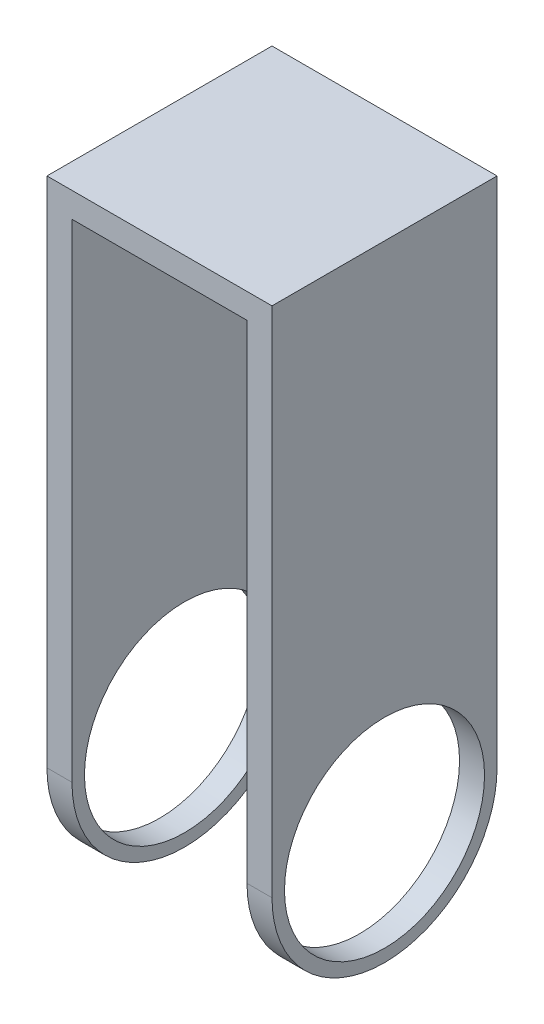
ISO-10303-21;
HEADER;
FILE_DESCRIPTION(('STEP AP214'),'2;1');
FILE_NAME('part.step','',(''),(''),'','','');
FILE_SCHEMA(('AUTOMOTIVE_DESIGN { 1 0 10303 214 1 1 1 1 }'));
ENDSEC;
DATA;
#1=APPLICATION_CONTEXT('core data for automotive mechanical design processes');
#2=APPLICATION_PROTOCOL_DEFINITION('international standard','automotive_design',2000,#1);
#3=PRODUCT_CONTEXT('',#1,'mechanical');
#4=PRODUCT('Part','Part','',(#3));
#5=PRODUCT_RELATED_PRODUCT_CATEGORY('part','',(#4));
#6=PRODUCT_DEFINITION_FORMATION('','',#4);
#7=PRODUCT_DEFINITION_CONTEXT('part definition',#1,'design');
#8=PRODUCT_DEFINITION('design','',#6,#7);
#9=PRODUCT_DEFINITION_SHAPE('','',#8);
#10=(LENGTH_UNIT() NAMED_UNIT(*) SI_UNIT(.MILLI.,.METRE.));
#11=(NAMED_UNIT(*) PLANE_ANGLE_UNIT() SI_UNIT($,.RADIAN.));
#12=(NAMED_UNIT(*) SI_UNIT($,.STERADIAN.) SOLID_ANGLE_UNIT());
#13=UNCERTAINTY_MEASURE_WITH_UNIT(LENGTH_MEASURE(1.E-05),#10,'distance_accuracy_value','');
#14=(GEOMETRIC_REPRESENTATION_CONTEXT(3) GLOBAL_UNCERTAINTY_ASSIGNED_CONTEXT((#13)) GLOBAL_UNIT_ASSIGNED_CONTEXT((#10,
#11,#12)) REPRESENTATION_CONTEXT('',''));
#15=CARTESIAN_POINT('',(0.,0.,0.));
#16=DIRECTION('',(0.,0.,1.));
#17=DIRECTION('',(1.,0.,0.));
#18=AXIS2_PLACEMENT_3D('',#15,#16,#17);
#19=CARTESIAN_POINT('',(4.,1.,-4.5));
#20=DIRECTION('',(-1.,0.,0.));
#21=DIRECTION('',(0.,0.,1.));
#22=AXIS2_PLACEMENT_3D('',#19,#20,#21);
#23=PLANE('',#22);
#24=DIRECTION('',(0.,-1.,0.));
#25=VECTOR('',#24,1.);
#26=CARTESIAN_POINT('',(4.,1.,4.5));
#27=LINE('',#26,#25);
#28=CARTESIAN_POINT('',(4.,1.,4.5));
#29=VERTEX_POINT('',#28);
#30=CARTESIAN_POINT('',(3.99999999999997,-19.5,4.5));
#31=VERTEX_POINT('',#30);
#32=EDGE_CURVE('E101',#29,#31,#27,.T.);
#33=ORIENTED_EDGE('',*,*,#32,.T.);
#34=CARTESIAN_POINT('',(4.,-19.5,0.));
#35=DIRECTION('',(-1.,0.,0.));
#36=DIRECTION('',(0.,0.,1.));
#37=AXIS2_PLACEMENT_3D('',#34,#35,#36);
#38=CIRCLE('',#37,4.5);
#39=CARTESIAN_POINT('',(4.00000000000003,-19.5,-4.5));
#40=VERTEX_POINT('',#39);
#41=EDGE_CURVE('E141',#40,#31,#38,.T.);
#42=ORIENTED_EDGE('',*,*,#41,.F.);
#43=DIRECTION('',(0.,-1.,0.));
#44=VECTOR('',#43,1.);
#45=CARTESIAN_POINT('',(4.,1.,-4.5));
#46=LINE('',#45,#44);
#47=CARTESIAN_POINT('',(4.,1.,-4.5));
#48=VERTEX_POINT('',#47);
#49=EDGE_CURVE('E44',#48,#40,#46,.T.);
#50=ORIENTED_EDGE('',*,*,#49,.F.);
#51=DIRECTION('',(0.,0.,-1.));
#52=VECTOR('',#51,1.);
#53=CARTESIAN_POINT('',(4.,1.,-4.5));
#54=LINE('',#53,#52);
#55=EDGE_CURVE('E158',#29,#48,#54,.T.);
#56=ORIENTED_EDGE('',*,*,#55,.F.);
#57=EDGE_LOOP('',(#33,#42,#50,#56));
#58=FACE_BOUND('',#57,.T.);
#59=CARTESIAN_POINT('',(4.,-19.5,0.));
#60=DIRECTION('',(-1.,0.,0.));
#61=DIRECTION('',(0.,0.,1.));
#62=AXIS2_PLACEMENT_3D('',#59,#60,#61);
#63=CIRCLE('',#62,4.);
#64=CARTESIAN_POINT('',(3.99999999999997,-19.5,4.));
#65=VERTEX_POINT('',#64);
#66=EDGE_CURVE('E136',#65,#65,#63,.T.);
#67=ORIENTED_EDGE('',*,*,#66,.T.);
#68=EDGE_LOOP('',(#67));
#69=FACE_BOUND('',#68,.T.);
#70=ADVANCED_FACE('F36',(#58,#69),#23,.F.);
#71=CARTESIAN_POINT('',(-4.,1.,-4.5));
#72=DIRECTION('',(0.,0.,1.));
#73=DIRECTION('',(1.,0.,0.));
#74=AXIS2_PLACEMENT_3D('',#71,#72,#73);
#75=PLANE('',#74);
#76=DIRECTION('',(-1.,0.,0.));
#77=VECTOR('',#76,1.);
#78=CARTESIAN_POINT('',(-4.,0.,-4.5));
#79=LINE('',#78,#77);
#80=CARTESIAN_POINT('',(3.00000000000003,0.,-4.50000000000001));
#81=VERTEX_POINT('',#80);
#82=CARTESIAN_POINT('',(-4.,0.,-4.5));
#83=VERTEX_POINT('',#82);
#84=EDGE_CURVE('E157',#81,#83,#79,.T.);
#85=ORIENTED_EDGE('',*,*,#84,.T.);
#86=DIRECTION('',(0.,1.,0.));
#87=VECTOR('',#86,1.);
#88=CARTESIAN_POINT('',(-4.,1.,-4.5));
#89=LINE('',#88,#87);
#90=CARTESIAN_POINT('',(-4.,-19.5,-4.5));
#91=VERTEX_POINT('',#90);
#92=EDGE_CURVE('E116',#91,#83,#89,.T.);
#93=ORIENTED_EDGE('',*,*,#92,.F.);
#94=DIRECTION('',(1.,0.,0.));
#95=VECTOR('',#94,1.);
#96=CARTESIAN_POINT('',(-5.,-19.5,-4.5));
#97=LINE('',#96,#95);
#98=CARTESIAN_POINT('',(-5.,-19.5,-4.5));
#99=VERTEX_POINT('',#98);
#100=EDGE_CURVE('E134',#99,#91,#97,.T.);
#101=ORIENTED_EDGE('',*,*,#100,.F.);
#102=DIRECTION('',(0.,1.,0.));
#103=VECTOR('',#102,1.);
#104=CARTESIAN_POINT('',(-5.,1.,-4.5));
#105=LINE('',#104,#103);
#106=CARTESIAN_POINT('',(-5.,1.,-4.5));
#107=VERTEX_POINT('',#106);
#108=EDGE_CURVE('E126',#99,#107,#105,.T.);
#109=ORIENTED_EDGE('',*,*,#108,.T.);
#110=DIRECTION('',(-1.,0.,0.));
#111=VECTOR('',#110,1.);
#112=CARTESIAN_POINT('',(-4.,1.,-4.5));
#113=LINE('',#112,#111);
#114=EDGE_CURVE('E103',#48,#107,#113,.T.);
#115=ORIENTED_EDGE('',*,*,#114,.F.);
#116=ORIENTED_EDGE('',*,*,#49,.T.);
#117=DIRECTION('',(1.,0.,0.));
#118=VECTOR('',#117,1.);
#119=CARTESIAN_POINT('',(3.00000000000003,-19.5,-4.5));
#120=LINE('',#119,#118);
#121=CARTESIAN_POINT('',(3.00000000000003,-19.5,-4.5));
#122=VERTEX_POINT('',#121);
#123=EDGE_CURVE('E154',#122,#40,#120,.T.);
#124=ORIENTED_EDGE('',*,*,#123,.F.);
#125=DIRECTION('',(0.,-1.,0.));
#126=VECTOR('',#125,1.);
#127=CARTESIAN_POINT('',(3.00000000000003,1.,-4.50000000000001));
#128=LINE('',#127,#126);
#129=EDGE_CURVE('E144',#81,#122,#128,.T.);
#130=ORIENTED_EDGE('',*,*,#129,.F.);
#131=EDGE_LOOP('',(#85,#93,#101,#109,#115,#116,#124,#130));
#132=FACE_BOUND('',#131,.T.);
#133=ADVANCED_FACE('F171',(#132),#75,.F.);
#134=CARTESIAN_POINT('',(-4.,1.,4.5));
#135=DIRECTION('',(0.,0.,-1.));
#136=DIRECTION('',(-1.,0.,0.));
#137=AXIS2_PLACEMENT_3D('',#134,#135,#136);
#138=PLANE('',#137);
#139=DIRECTION('',(1.,0.,0.));
#140=VECTOR('',#139,1.);
#141=CARTESIAN_POINT('',(-4.,0.,4.5));
#142=LINE('',#141,#140);
#143=CARTESIAN_POINT('',(-4.,0.,4.5));
#144=VERTEX_POINT('',#143);
#145=CARTESIAN_POINT('',(2.99999999999997,0.,4.49999999999999));
#146=VERTEX_POINT('',#145);
#147=EDGE_CURVE('E160',#144,#146,#142,.T.);
#148=ORIENTED_EDGE('',*,*,#147,.T.);
#149=DIRECTION('',(0.,1.,0.));
#150=VECTOR('',#149,1.);
#151=CARTESIAN_POINT('',(2.99999999999997,1.,4.49999999999999));
#152=LINE('',#151,#150);
#153=CARTESIAN_POINT('',(2.99999999999997,-19.5,4.5));
#154=VERTEX_POINT('',#153);
#155=EDGE_CURVE('E148',#154,#146,#152,.T.);
#156=ORIENTED_EDGE('',*,*,#155,.F.);
#157=DIRECTION('',(1.,0.,0.));
#158=VECTOR('',#157,1.);
#159=CARTESIAN_POINT('',(2.99999999999997,-19.5,4.5));
#160=LINE('',#159,#158);
#161=EDGE_CURVE('E150',#154,#31,#160,.T.);
#162=ORIENTED_EDGE('',*,*,#161,.T.);
#163=ORIENTED_EDGE('',*,*,#32,.F.);
#164=DIRECTION('',(1.,0.,0.));
#165=VECTOR('',#164,1.);
#166=CARTESIAN_POINT('',(-4.,1.,4.5));
#167=LINE('',#166,#165);
#168=CARTESIAN_POINT('',(-5.,1.,4.5));
#169=VERTEX_POINT('',#168);
#170=EDGE_CURVE('E51',#169,#29,#167,.T.);
#171=ORIENTED_EDGE('',*,*,#170,.F.);
#172=DIRECTION('',(0.,-1.,0.));
#173=VECTOR('',#172,1.);
#174=CARTESIAN_POINT('',(-5.,1.,4.5));
#175=LINE('',#174,#173);
#176=CARTESIAN_POINT('',(-5.,-19.5,4.5));
#177=VERTEX_POINT('',#176);
#178=EDGE_CURVE('E99',#169,#177,#175,.T.);
#179=ORIENTED_EDGE('',*,*,#178,.T.);
#180=DIRECTION('',(1.,0.,0.));
#181=VECTOR('',#180,1.);
#182=CARTESIAN_POINT('',(-5.,-19.5,4.5));
#183=LINE('',#182,#181);
#184=CARTESIAN_POINT('',(-4.,-19.5,4.5));
#185=VERTEX_POINT('',#184);
#186=EDGE_CURVE('E128',#177,#185,#183,.T.);
#187=ORIENTED_EDGE('',*,*,#186,.T.);
#188=DIRECTION('',(0.,-1.,0.));
#189=VECTOR('',#188,1.);
#190=CARTESIAN_POINT('',(-4.,1.,4.5));
#191=LINE('',#190,#189);
#192=EDGE_CURVE('E129',#144,#185,#191,.T.);
#193=ORIENTED_EDGE('',*,*,#192,.F.);
#194=EDGE_LOOP('',(#148,#156,#162,#163,#171,#179,#187,#193));
#195=FACE_BOUND('',#194,.T.);
#196=ADVANCED_FACE('F97',(#195),#138,.F.);
#197=CARTESIAN_POINT('',(0.,1.,0.));
#198=DIRECTION('',(0.,1.,0.));
#199=DIRECTION('',(0.,0.,1.));
#200=AXIS2_PLACEMENT_3D('',#197,#198,#199);
#201=PLANE('',#200);
#202=ORIENTED_EDGE('',*,*,#170,.T.);
#203=ORIENTED_EDGE('',*,*,#55,.T.);
#204=ORIENTED_EDGE('',*,*,#114,.T.);
#205=DIRECTION('',(0.,0.,1.));
#206=VECTOR('',#205,1.);
#207=CARTESIAN_POINT('',(-5.,1.,4.5));
#208=LINE('',#207,#206);
#209=EDGE_CURVE('E110',#107,#169,#208,.T.);
#210=ORIENTED_EDGE('',*,*,#209,.T.);
#211=EDGE_LOOP('',(#202,#203,#204,#210));
#212=FACE_BOUND('',#211,.T.);
#213=ADVANCED_FACE('F115',(#212),#201,.T.);
#214=CARTESIAN_POINT('',(0.,0.,0.));
#215=DIRECTION('',(0.,1.,0.));
#216=DIRECTION('',(0.,0.,1.));
#217=AXIS2_PLACEMENT_3D('',#214,#215,#216);
#218=PLANE('',#217);
#219=ORIENTED_EDGE('',*,*,#84,.F.);
#220=DIRECTION('',(0.,0.,1.));
#221=VECTOR('',#220,1.);
#222=CARTESIAN_POINT('',(3.,0.,0.));
#223=LINE('',#222,#221);
#224=EDGE_CURVE('E11',#81,#146,#223,.T.);
#225=ORIENTED_EDGE('',*,*,#224,.T.);
#226=ORIENTED_EDGE('',*,*,#147,.F.);
#227=DIRECTION('',(0.,0.,1.));
#228=VECTOR('',#227,1.);
#229=CARTESIAN_POINT('',(-4.,0.,-4.5));
#230=LINE('',#229,#228);
#231=EDGE_CURVE('E164',#83,#144,#230,.T.);
#232=ORIENTED_EDGE('',*,*,#231,.F.);
#233=EDGE_LOOP('',(#219,#225,#226,#232));
#234=FACE_BOUND('',#233,.T.);
#235=ADVANCED_FACE('F199',(#234),#218,.F.);
#236=CARTESIAN_POINT('',(3.,-19.5,0.));
#237=DIRECTION('',(-1.,0.,0.));
#238=DIRECTION('',(0.,0.,1.));
#239=AXIS2_PLACEMENT_3D('',#236,#237,#238);
#240=PLANE('',#239);
#241=CARTESIAN_POINT('',(3.,-19.5,0.));
#242=DIRECTION('',(-1.,0.,0.));
#243=DIRECTION('',(0.,0.,1.));
#244=AXIS2_PLACEMENT_3D('',#241,#242,#243);
#245=CIRCLE('',#244,4.);
#246=CARTESIAN_POINT('',(2.99999999999997,-19.5,4.));
#247=VERTEX_POINT('',#246);
#248=EDGE_CURVE('E138',#247,#247,#245,.T.);
#249=ORIENTED_EDGE('',*,*,#248,.F.);
#250=EDGE_LOOP('',(#249));
#251=FACE_BOUND('',#250,.T.);
#252=ORIENTED_EDGE('',*,*,#224,.F.);
#253=ORIENTED_EDGE('',*,*,#129,.T.);
#254=CARTESIAN_POINT('',(3.,-19.5,0.));
#255=DIRECTION('',(-1.,0.,0.));
#256=DIRECTION('',(0.,0.,1.));
#257=AXIS2_PLACEMENT_3D('',#254,#255,#256);
#258=CIRCLE('',#257,4.5);
#259=EDGE_CURVE('E146',#122,#154,#258,.T.);
#260=ORIENTED_EDGE('',*,*,#259,.T.);
#261=ORIENTED_EDGE('',*,*,#155,.T.);
#262=EDGE_LOOP('',(#252,#253,#260,#261));
#263=FACE_BOUND('',#262,.T.);
#264=ADVANCED_FACE('F194',(#251,#263),#240,.T.);
#265=CARTESIAN_POINT('',(3.,-19.5,0.));
#266=DIRECTION('',(1.,0.,0.));
#267=DIRECTION('',(0.,0.,-1.));
#268=AXIS2_PLACEMENT_3D('',#265,#266,#267);
#269=CYLINDRICAL_SURFACE('',#268,4.5);
#270=ORIENTED_EDGE('',*,*,#41,.T.);
#271=ORIENTED_EDGE('',*,*,#161,.F.);
#272=ORIENTED_EDGE('',*,*,#259,.F.);
#273=ORIENTED_EDGE('',*,*,#123,.T.);
#274=EDGE_LOOP('',(#270,#271,#272,#273));
#275=FACE_BOUND('',#274,.T.);
#276=ADVANCED_FACE('F177',(#275),#269,.T.);
#277=CARTESIAN_POINT('',(3.,-19.5,0.));
#278=DIRECTION('',(1.,0.,0.));
#279=DIRECTION('',(0.,0.,-1.));
#280=AXIS2_PLACEMENT_3D('',#277,#278,#279);
#281=CYLINDRICAL_SURFACE('',#280,4.);
#282=ORIENTED_EDGE('',*,*,#248,.T.);
#283=EDGE_LOOP('',(#282));
#284=FACE_BOUND('',#283,.T.);
#285=ORIENTED_EDGE('',*,*,#66,.F.);
#286=EDGE_LOOP('',(#285));
#287=FACE_BOUND('',#286,.T.);
#288=ADVANCED_FACE('F183',(#284,#287),#281,.F.);
#289=CARTESIAN_POINT('',(-5.,-19.5,0.));
#290=DIRECTION('',(1.,0.,0.));
#291=DIRECTION('',(0.,0.,-1.));
#292=AXIS2_PLACEMENT_3D('',#289,#290,#291);
#293=CYLINDRICAL_SURFACE('',#292,4.5);
#294=CARTESIAN_POINT('',(-4.,-19.5,0.));
#295=DIRECTION('',(1.,0.,0.));
#296=DIRECTION('',(0.,0.,-1.));
#297=AXIS2_PLACEMENT_3D('',#294,#295,#296);
#298=CIRCLE('',#297,4.5);
#299=EDGE_CURVE('E119',#185,#91,#298,.T.);
#300=ORIENTED_EDGE('',*,*,#299,.F.);
#301=ORIENTED_EDGE('',*,*,#186,.F.);
#302=CARTESIAN_POINT('',(-5.,-19.5,0.));
#303=DIRECTION('',(1.,0.,0.));
#304=DIRECTION('',(0.,0.,-1.));
#305=AXIS2_PLACEMENT_3D('',#302,#303,#304);
#306=CIRCLE('',#305,4.5);
#307=EDGE_CURVE('E113',#177,#99,#306,.T.);
#308=ORIENTED_EDGE('',*,*,#307,.T.);
#309=ORIENTED_EDGE('',*,*,#100,.T.);
#310=EDGE_LOOP('',(#300,#301,#308,#309));
#311=FACE_BOUND('',#310,.T.);
#312=ADVANCED_FACE('F185',(#311),#293,.T.);
#313=CARTESIAN_POINT('',(-5.,-19.5,0.));
#314=DIRECTION('',(1.,0.,0.));
#315=DIRECTION('',(0.,0.,-1.));
#316=AXIS2_PLACEMENT_3D('',#313,#314,#315);
#317=PLANE('',#316);
#318=CARTESIAN_POINT('',(-5.,-19.5,0.));
#319=DIRECTION('',(1.,0.,0.));
#320=DIRECTION('',(0.,0.,-1.));
#321=AXIS2_PLACEMENT_3D('',#318,#319,#320);
#322=CIRCLE('',#321,4.);
#323=CARTESIAN_POINT('',(-5.,-19.5,-4.));
#324=VERTEX_POINT('',#323);
#325=EDGE_CURVE('E131',#324,#324,#322,.T.);
#326=ORIENTED_EDGE('',*,*,#325,.T.);
#327=EDGE_LOOP('',(#326));
#328=FACE_BOUND('',#327,.T.);
#329=ORIENTED_EDGE('',*,*,#209,.F.);
#330=ORIENTED_EDGE('',*,*,#108,.F.);
#331=ORIENTED_EDGE('',*,*,#307,.F.);
#332=ORIENTED_EDGE('',*,*,#178,.F.);
#333=EDGE_LOOP('',(#329,#330,#331,#332));
#334=FACE_BOUND('',#333,.T.);
#335=ADVANCED_FACE('F108',(#328,#334),#317,.F.);
#336=CARTESIAN_POINT('',(-4.,-19.5,0.));
#337=DIRECTION('',(1.,0.,0.));
#338=DIRECTION('',(0.,0.,-1.));
#339=AXIS2_PLACEMENT_3D('',#336,#337,#338);
#340=PLANE('',#339);
#341=CARTESIAN_POINT('',(-4.,-19.5,0.));
#342=DIRECTION('',(1.,0.,0.));
#343=DIRECTION('',(0.,0.,-1.));
#344=AXIS2_PLACEMENT_3D('',#341,#342,#343);
#345=CIRCLE('',#344,4.);
#346=CARTESIAN_POINT('',(-4.,-19.5,-4.));
#347=VERTEX_POINT('',#346);
#348=EDGE_CURVE('E122',#347,#347,#345,.T.);
#349=ORIENTED_EDGE('',*,*,#348,.F.);
#350=EDGE_LOOP('',(#349));
#351=FACE_BOUND('',#350,.T.);
#352=ORIENTED_EDGE('',*,*,#92,.T.);
#353=ORIENTED_EDGE('',*,*,#231,.T.);
#354=ORIENTED_EDGE('',*,*,#192,.T.);
#355=ORIENTED_EDGE('',*,*,#299,.T.);
#356=EDGE_LOOP('',(#352,#353,#354,#355));
#357=FACE_BOUND('',#356,.T.);
#358=ADVANCED_FACE('F270',(#351,#357),#340,.T.);
#359=CARTESIAN_POINT('',(-5.,-19.5,0.));
#360=DIRECTION('',(1.,0.,0.));
#361=DIRECTION('',(0.,0.,-1.));
#362=AXIS2_PLACEMENT_3D('',#359,#360,#361);
#363=CYLINDRICAL_SURFACE('',#362,4.);
#364=ORIENTED_EDGE('',*,*,#325,.F.);
#365=EDGE_LOOP('',(#364));
#366=FACE_BOUND('',#365,.T.);
#367=ORIENTED_EDGE('',*,*,#348,.T.);
#368=EDGE_LOOP('',(#367));
#369=FACE_BOUND('',#368,.T.);
#370=ADVANCED_FACE('F279',(#366,#369),#363,.F.);
#371=CLOSED_SHELL('',(#70,#133,#196,#213,#235,#264,#276,#288,#312,#335,#358,#370));
#372=MANIFOLD_SOLID_BREP('B2',#371);
#373=ADVANCED_BREP_SHAPE_REPRESENTATION('',(#18,#372),#14);
#374=SHAPE_DEFINITION_REPRESENTATION(#9,#373);
ENDSEC;
END-ISO-10303-21;
